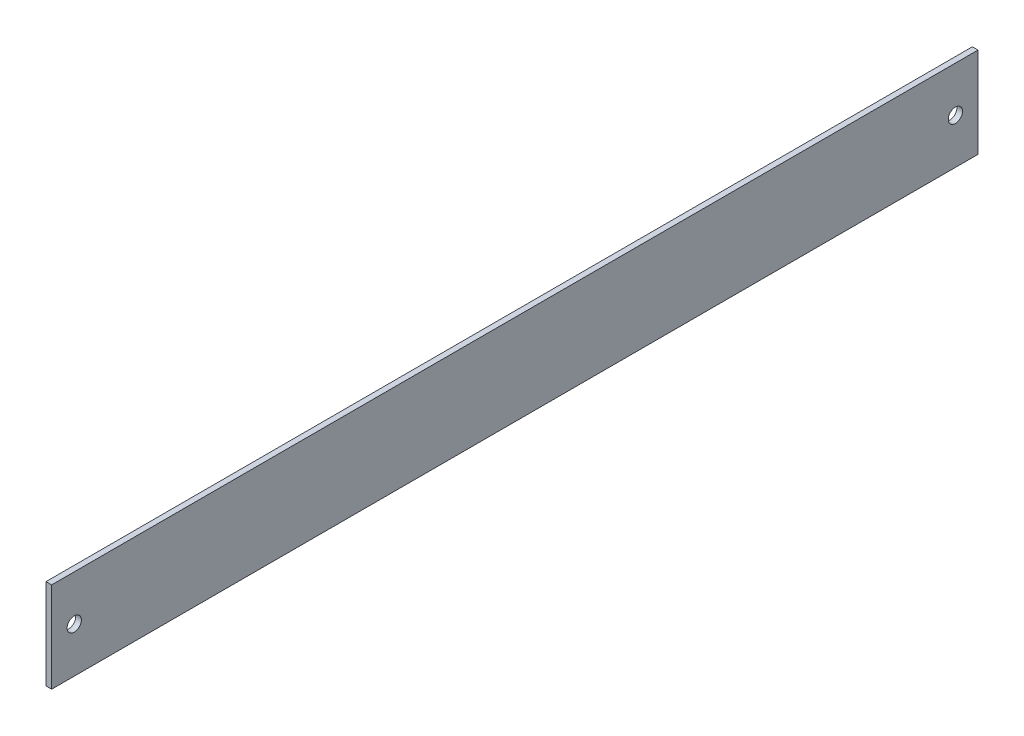
ISO-10303-21;
HEADER;
FILE_DESCRIPTION(('STEP AP214'),'2;1');
FILE_NAME('part.step','',(''),(''),'','','');
FILE_SCHEMA(('AUTOMOTIVE_DESIGN { 1 0 10303 214 1 1 1 1 }'));
ENDSEC;
DATA;
#1=APPLICATION_CONTEXT('core data for automotive mechanical design processes');
#2=APPLICATION_PROTOCOL_DEFINITION('international standard','automotive_design',2000,#1);
#3=PRODUCT_CONTEXT('',#1,'mechanical');
#4=PRODUCT('Part','Part','',(#3));
#5=PRODUCT_RELATED_PRODUCT_CATEGORY('part','',(#4));
#6=PRODUCT_DEFINITION_FORMATION('','',#4);
#7=PRODUCT_DEFINITION_CONTEXT('part definition',#1,'design');
#8=PRODUCT_DEFINITION('design','',#6,#7);
#9=PRODUCT_DEFINITION_SHAPE('','',#8);
#10=(LENGTH_UNIT() NAMED_UNIT(*) SI_UNIT(.MILLI.,.METRE.));
#11=(NAMED_UNIT(*) PLANE_ANGLE_UNIT() SI_UNIT($,.RADIAN.));
#12=(NAMED_UNIT(*) SI_UNIT($,.STERADIAN.) SOLID_ANGLE_UNIT());
#13=UNCERTAINTY_MEASURE_WITH_UNIT(LENGTH_MEASURE(1.E-05),#10,'distance_accuracy_value','');
#14=(GEOMETRIC_REPRESENTATION_CONTEXT(3) GLOBAL_UNCERTAINTY_ASSIGNED_CONTEXT((#13)) GLOBAL_UNIT_ASSIGNED_CONTEXT((#10,
#11,#12)) REPRESENTATION_CONTEXT('',''));
#15=CARTESIAN_POINT('',(0.,0.,0.));
#16=DIRECTION('',(0.,0.,1.));
#17=DIRECTION('',(1.,0.,0.));
#18=AXIS2_PLACEMENT_3D('',#15,#16,#17);
#19=CARTESIAN_POINT('',(3.175,0.,0.));
#20=DIRECTION('',(-1.,0.,0.));
#21=DIRECTION('',(0.,0.,1.));
#22=AXIS2_PLACEMENT_3D('',#19,#20,#21);
#23=PLANE('',#22);
#24=DIRECTION('',(0.,-1.,0.));
#25=VECTOR('',#24,1.);
#26=CARTESIAN_POINT('',(3.175,0.,0.));
#27=LINE('',#26,#25);
#28=CARTESIAN_POINT('',(3.175,50.8,0.));
#29=VERTEX_POINT('',#28);
#30=CARTESIAN_POINT('',(3.175,0.,0.));
#31=VERTEX_POINT('',#30);
#32=EDGE_CURVE('E90',#29,#31,#27,.T.);
#33=ORIENTED_EDGE('',*,*,#32,.T.);
#34=DIRECTION('',(0.,0.,-1.));
#35=VECTOR('',#34,1.);
#36=CARTESIAN_POINT('',(3.175,0.,0.));
#37=LINE('',#36,#35);
#38=CARTESIAN_POINT('',(3.175,0.,-520.7));
#39=VERTEX_POINT('',#38);
#40=EDGE_CURVE('E85',#31,#39,#37,.T.);
#41=ORIENTED_EDGE('',*,*,#40,.T.);
#42=DIRECTION('',(0.,1.,0.));
#43=VECTOR('',#42,1.);
#44=CARTESIAN_POINT('',(3.175,0.,-520.7));
#45=LINE('',#44,#43);
#46=CARTESIAN_POINT('',(3.175,50.8,-520.7));
#47=VERTEX_POINT('',#46);
#48=EDGE_CURVE('E88',#39,#47,#45,.T.);
#49=ORIENTED_EDGE('',*,*,#48,.T.);
#50=DIRECTION('',(0.,0.,1.));
#51=VECTOR('',#50,1.);
#52=CARTESIAN_POINT('',(3.175,50.8,0.));
#53=LINE('',#52,#51);
#54=EDGE_CURVE('E55',#47,#29,#53,.T.);
#55=ORIENTED_EDGE('',*,*,#54,.T.);
#56=EDGE_LOOP('',(#33,#41,#49,#55));
#57=FACE_BOUND('',#56,.T.);
#58=CARTESIAN_POINT('',(3.175,25.4,-12.7));
#59=DIRECTION('',(1.,0.,0.));
#60=DIRECTION('',(0.,0.,-1.));
#61=AXIS2_PLACEMENT_3D('',#58,#59,#60);
#62=CIRCLE('',#61,4.);
#63=CARTESIAN_POINT('',(3.175,25.4,-16.7));
#64=VERTEX_POINT('',#63);
#65=EDGE_CURVE('E105',#64,#64,#62,.T.);
#66=ORIENTED_EDGE('',*,*,#65,.F.);
#67=EDGE_LOOP('',(#66));
#68=FACE_BOUND('',#67,.T.);
#69=CARTESIAN_POINT('',(3.175,25.4,-508.));
#70=DIRECTION('',(1.,0.,0.));
#71=DIRECTION('',(0.,0.,-1.));
#72=AXIS2_PLACEMENT_3D('',#69,#70,#71);
#73=CIRCLE('',#72,3.99999999999988);
#74=CARTESIAN_POINT('',(3.175,25.4,-512.));
#75=VERTEX_POINT('',#74);
#76=EDGE_CURVE('E120',#75,#75,#73,.T.);
#77=ORIENTED_EDGE('',*,*,#76,.F.);
#78=EDGE_LOOP('',(#77));
#79=FACE_BOUND('',#78,.T.);
#80=ADVANCED_FACE('F38',(#57,#68,#79),#23,.F.);
#81=CARTESIAN_POINT('',(0.,0.,0.));
#82=DIRECTION('',(-1.,0.,0.));
#83=DIRECTION('',(0.,0.,1.));
#84=AXIS2_PLACEMENT_3D('',#81,#82,#83);
#85=PLANE('',#84);
#86=CARTESIAN_POINT('',(0.,25.4,-12.7));
#87=DIRECTION('',(1.,0.,0.));
#88=DIRECTION('',(0.,0.,-1.));
#89=AXIS2_PLACEMENT_3D('',#86,#87,#88);
#90=CIRCLE('',#89,4.);
#91=CARTESIAN_POINT('',(0.,25.4,-16.7));
#92=VERTEX_POINT('',#91);
#93=EDGE_CURVE('E117',#92,#92,#90,.T.);
#94=ORIENTED_EDGE('',*,*,#93,.T.);
#95=EDGE_LOOP('',(#94));
#96=FACE_BOUND('',#95,.T.);
#97=DIRECTION('',(0.,-1.,0.));
#98=VECTOR('',#97,1.);
#99=CARTESIAN_POINT('',(0.,0.,0.));
#100=LINE('',#99,#98);
#101=CARTESIAN_POINT('',(0.,50.8,0.));
#102=VERTEX_POINT('',#101);
#103=CARTESIAN_POINT('',(0.,0.,0.));
#104=VERTEX_POINT('',#103);
#105=EDGE_CURVE('E102',#102,#104,#100,.T.);
#106=ORIENTED_EDGE('',*,*,#105,.F.);
#107=DIRECTION('',(0.,0.,1.));
#108=VECTOR('',#107,1.);
#109=CARTESIAN_POINT('',(0.,50.8,0.));
#110=LINE('',#109,#108);
#111=CARTESIAN_POINT('',(0.,50.8,-520.7));
#112=VERTEX_POINT('',#111);
#113=EDGE_CURVE('E78',#112,#102,#110,.T.);
#114=ORIENTED_EDGE('',*,*,#113,.F.);
#115=DIRECTION('',(0.,1.,0.));
#116=VECTOR('',#115,1.);
#117=CARTESIAN_POINT('',(0.,0.,-520.7));
#118=LINE('',#117,#116);
#119=CARTESIAN_POINT('',(0.,0.,-520.7));
#120=VERTEX_POINT('',#119);
#121=EDGE_CURVE('E72',#120,#112,#118,.T.);
#122=ORIENTED_EDGE('',*,*,#121,.F.);
#123=DIRECTION('',(0.,0.,-1.));
#124=VECTOR('',#123,1.);
#125=CARTESIAN_POINT('',(0.,0.,0.));
#126=LINE('',#125,#124);
#127=EDGE_CURVE('E94',#104,#120,#126,.T.);
#128=ORIENTED_EDGE('',*,*,#127,.F.);
#129=EDGE_LOOP('',(#106,#114,#122,#128));
#130=FACE_BOUND('',#129,.T.);
#131=CARTESIAN_POINT('',(0.,25.4,-508.));
#132=DIRECTION('',(1.,0.,0.));
#133=DIRECTION('',(0.,0.,-1.));
#134=AXIS2_PLACEMENT_3D('',#131,#132,#133);
#135=CIRCLE('',#134,3.99999999999988);
#136=CARTESIAN_POINT('',(0.,25.4,-512.));
#137=VERTEX_POINT('',#136);
#138=EDGE_CURVE('E123',#137,#137,#135,.T.);
#139=ORIENTED_EDGE('',*,*,#138,.T.);
#140=EDGE_LOOP('',(#139));
#141=FACE_BOUND('',#140,.T.);
#142=ADVANCED_FACE('F113',(#96,#130,#141),#85,.T.);
#143=CARTESIAN_POINT('',(3.175,0.,0.));
#144=DIRECTION('',(0.,0.,-1.));
#145=DIRECTION('',(-1.,0.,0.));
#146=AXIS2_PLACEMENT_3D('',#143,#144,#145);
#147=PLANE('',#146);
#148=ORIENTED_EDGE('',*,*,#105,.T.);
#149=DIRECTION('',(-1.,0.,0.));
#150=VECTOR('',#149,1.);
#151=CARTESIAN_POINT('',(3.175,0.,0.));
#152=LINE('',#151,#150);
#153=EDGE_CURVE('E11',#31,#104,#152,.T.);
#154=ORIENTED_EDGE('',*,*,#153,.F.);
#155=ORIENTED_EDGE('',*,*,#32,.F.);
#156=DIRECTION('',(-1.,0.,0.));
#157=VECTOR('',#156,1.);
#158=CARTESIAN_POINT('',(3.175,50.8,0.));
#159=LINE('',#158,#157);
#160=EDGE_CURVE('E98',#29,#102,#159,.T.);
#161=ORIENTED_EDGE('',*,*,#160,.T.);
#162=EDGE_LOOP('',(#148,#154,#155,#161));
#163=FACE_BOUND('',#162,.T.);
#164=ADVANCED_FACE('F40',(#163),#147,.F.);
#165=CARTESIAN_POINT('',(3.175,0.,0.));
#166=DIRECTION('',(0.,1.,0.));
#167=DIRECTION('',(0.,0.,1.));
#168=AXIS2_PLACEMENT_3D('',#165,#166,#167);
#169=PLANE('',#168);
#170=ORIENTED_EDGE('',*,*,#127,.T.);
#171=DIRECTION('',(-1.,0.,0.));
#172=VECTOR('',#171,1.);
#173=CARTESIAN_POINT('',(3.175,0.,-520.7));
#174=LINE('',#173,#172);
#175=EDGE_CURVE('E47',#39,#120,#174,.T.);
#176=ORIENTED_EDGE('',*,*,#175,.F.);
#177=ORIENTED_EDGE('',*,*,#40,.F.);
#178=ORIENTED_EDGE('',*,*,#153,.T.);
#179=EDGE_LOOP('',(#170,#176,#177,#178));
#180=FACE_BOUND('',#179,.T.);
#181=ADVANCED_FACE('F93',(#180),#169,.F.);
#182=CARTESIAN_POINT('',(3.175,0.,-520.7));
#183=DIRECTION('',(0.,0.,1.));
#184=DIRECTION('',(1.,0.,0.));
#185=AXIS2_PLACEMENT_3D('',#182,#183,#184);
#186=PLANE('',#185);
#187=ORIENTED_EDGE('',*,*,#121,.T.);
#188=DIRECTION('',(-1.,0.,0.));
#189=VECTOR('',#188,1.);
#190=CARTESIAN_POINT('',(3.175,50.8,-520.7));
#191=LINE('',#190,#189);
#192=EDGE_CURVE('E95',#47,#112,#191,.T.);
#193=ORIENTED_EDGE('',*,*,#192,.F.);
#194=ORIENTED_EDGE('',*,*,#48,.F.);
#195=ORIENTED_EDGE('',*,*,#175,.T.);
#196=EDGE_LOOP('',(#187,#193,#194,#195));
#197=FACE_BOUND('',#196,.T.);
#198=ADVANCED_FACE('F96',(#197),#186,.F.);
#199=CARTESIAN_POINT('',(3.175,50.8,0.));
#200=DIRECTION('',(0.,-1.,0.));
#201=DIRECTION('',(0.,0.,-1.));
#202=AXIS2_PLACEMENT_3D('',#199,#200,#201);
#203=PLANE('',#202);
#204=ORIENTED_EDGE('',*,*,#113,.T.);
#205=ORIENTED_EDGE('',*,*,#160,.F.);
#206=ORIENTED_EDGE('',*,*,#54,.F.);
#207=ORIENTED_EDGE('',*,*,#192,.T.);
#208=EDGE_LOOP('',(#204,#205,#206,#207));
#209=FACE_BOUND('',#208,.T.);
#210=ADVANCED_FACE('F110',(#209),#203,.F.);
#211=CARTESIAN_POINT('',(3.175,25.4,-12.7));
#212=DIRECTION('',(-1.,0.,0.));
#213=DIRECTION('',(0.,0.,1.));
#214=AXIS2_PLACEMENT_3D('',#211,#212,#213);
#215=CYLINDRICAL_SURFACE('',#214,4.);
#216=ORIENTED_EDGE('',*,*,#65,.T.);
#217=EDGE_LOOP('',(#216));
#218=FACE_BOUND('',#217,.T.);
#219=ORIENTED_EDGE('',*,*,#93,.F.);
#220=EDGE_LOOP('',(#219));
#221=FACE_BOUND('',#220,.T.);
#222=ADVANCED_FACE('F140',(#218,#221),#215,.F.);
#223=CARTESIAN_POINT('',(3.175,25.4,-508.));
#224=DIRECTION('',(-1.,0.,0.));
#225=DIRECTION('',(0.,0.,1.));
#226=AXIS2_PLACEMENT_3D('',#223,#224,#225);
#227=CYLINDRICAL_SURFACE('',#226,3.99999999999988);
#228=ORIENTED_EDGE('',*,*,#76,.T.);
#229=EDGE_LOOP('',(#228));
#230=FACE_BOUND('',#229,.T.);
#231=ORIENTED_EDGE('',*,*,#138,.F.);
#232=EDGE_LOOP('',(#231));
#233=FACE_BOUND('',#232,.T.);
#234=ADVANCED_FACE('F129',(#230,#233),#227,.F.);
#235=CLOSED_SHELL('',(#80,#142,#164,#181,#198,#210,#222,#234));
#236=MANIFOLD_SOLID_BREP('B2',#235);
#237=ADVANCED_BREP_SHAPE_REPRESENTATION('',(#18,#236),#14);
#238=SHAPE_DEFINITION_REPRESENTATION(#9,#237);
ENDSEC;
END-ISO-10303-21;
